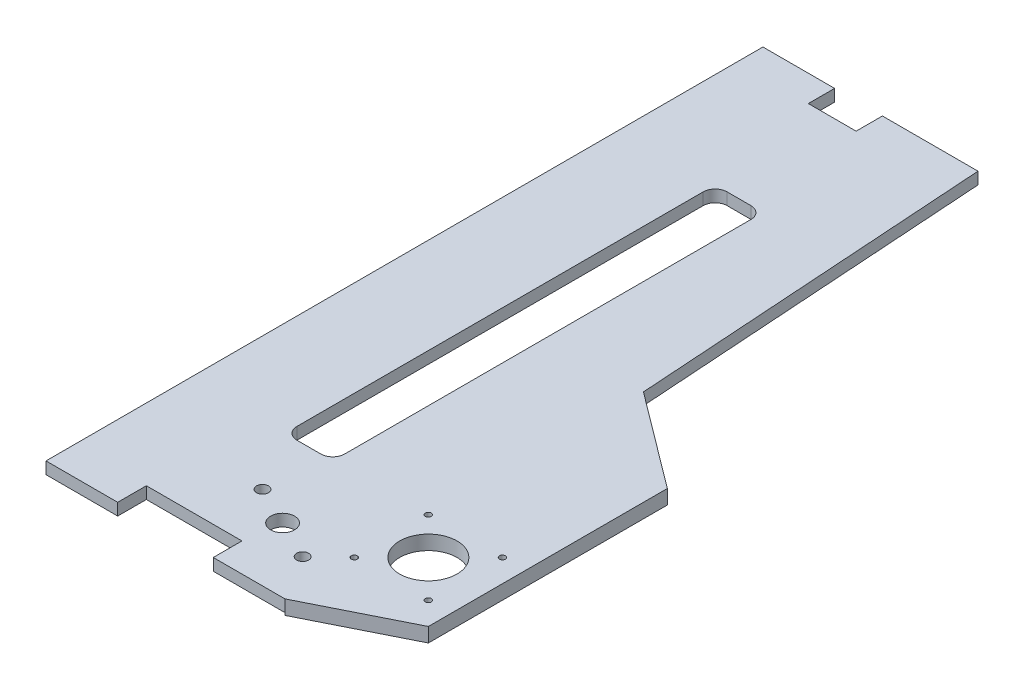
ISO-10303-21;
HEADER;
FILE_DESCRIPTION(('STEP AP214'),'2;1');
FILE_NAME('part.step','',(''),(''),'','','');
FILE_SCHEMA(('AUTOMOTIVE_DESIGN { 1 0 10303 214 1 1 1 1 }'));
ENDSEC;
DATA;
#1=APPLICATION_CONTEXT('core data for automotive mechanical design processes');
#2=APPLICATION_PROTOCOL_DEFINITION('international standard','automotive_design',2000,#1);
#3=PRODUCT_CONTEXT('',#1,'mechanical');
#4=PRODUCT('Part','Part','',(#3));
#5=PRODUCT_RELATED_PRODUCT_CATEGORY('part','',(#4));
#6=PRODUCT_DEFINITION_FORMATION('','',#4);
#7=PRODUCT_DEFINITION_CONTEXT('part definition',#1,'design');
#8=PRODUCT_DEFINITION('design','',#6,#7);
#9=PRODUCT_DEFINITION_SHAPE('','',#8);
#10=(LENGTH_UNIT() NAMED_UNIT(*) SI_UNIT(.MILLI.,.METRE.));
#11=(NAMED_UNIT(*) PLANE_ANGLE_UNIT() SI_UNIT($,.RADIAN.));
#12=(NAMED_UNIT(*) SI_UNIT($,.STERADIAN.) SOLID_ANGLE_UNIT());
#13=UNCERTAINTY_MEASURE_WITH_UNIT(LENGTH_MEASURE(1.E-05),#10,'distance_accuracy_value','');
#14=(GEOMETRIC_REPRESENTATION_CONTEXT(3) GLOBAL_UNCERTAINTY_ASSIGNED_CONTEXT((#13)) GLOBAL_UNIT_ASSIGNED_CONTEXT((#10,
#11,#12)) REPRESENTATION_CONTEXT('',''));
#15=CARTESIAN_POINT('',(0.,0.,0.));
#16=DIRECTION('',(0.,0.,1.));
#17=DIRECTION('',(1.,0.,0.));
#18=AXIS2_PLACEMENT_3D('',#15,#16,#17);
#19=CARTESIAN_POINT('',(100.,-1.,0.));
#20=DIRECTION('',(-1.,0.,0.));
#21=DIRECTION('',(0.,0.,1.));
#22=AXIS2_PLACEMENT_3D('',#19,#20,#21);
#23=PLANE('',#22);
#24=DIRECTION('',(0.,1.,0.));
#25=VECTOR('',#24,1.);
#26=CARTESIAN_POINT('',(100.,-1.,-28.354356076261));
#27=LINE('',#26,#25);
#28=CARTESIAN_POINT('',(100.,-1.,-28.354356076261));
#29=VERTEX_POINT('',#28);
#30=CARTESIAN_POINT('',(100.,0.,-28.354356076261));
#31=VERTEX_POINT('',#30);
#32=EDGE_CURVE('E508',#29,#31,#27,.T.);
#33=ORIENTED_EDGE('',*,*,#32,.F.);
#34=DIRECTION('',(0.,0.,1.));
#35=VECTOR('',#34,1.);
#36=CARTESIAN_POINT('',(100.,-1.,0.));
#37=LINE('',#36,#35);
#38=CARTESIAN_POINT('',(100.,-1.,0.));
#39=VERTEX_POINT('',#38);
#40=EDGE_CURVE('E524',#29,#39,#37,.T.);
#41=ORIENTED_EDGE('',*,*,#40,.T.);
#42=DIRECTION('',(0.,1.,0.));
#43=VECTOR('',#42,1.);
#44=CARTESIAN_POINT('',(100.,-1.,0.));
#45=LINE('',#44,#43);
#46=CARTESIAN_POINT('',(100.,0.,0.));
#47=VERTEX_POINT('',#46);
#48=EDGE_CURVE('E539',#39,#47,#45,.T.);
#49=ORIENTED_EDGE('',*,*,#48,.T.);
#50=DIRECTION('',(0.,0.,-1.));
#51=VECTOR('',#50,1.);
#52=CARTESIAN_POINT('',(100.,0.,-300.));
#53=LINE('',#52,#51);
#54=EDGE_CURVE('E286',#47,#31,#53,.T.);
#55=ORIENTED_EDGE('',*,*,#54,.T.);
#56=EDGE_LOOP('',(#33,#41,#49,#55));
#57=FACE_BOUND('',#56,.T.);
#58=ADVANCED_FACE('F39',(#57),#23,.T.);
#59=DIRECTION('',(0.,1.,0.));
#60=VECTOR('',#59,1.);
#61=CARTESIAN_POINT('',(100.,-1.,-30.645643923739));
#62=LINE('',#61,#60);
#63=CARTESIAN_POINT('',(100.,0.,-30.645643923739));
#64=VERTEX_POINT('',#63);
#65=CARTESIAN_POINT('',(100.,-1.,-30.645643923739));
#66=VERTEX_POINT('',#65);
#67=EDGE_CURVE('E502',#64,#66,#62,.F.);
#68=ORIENTED_EDGE('',*,*,#67,.F.);
#69=CARTESIAN_POINT('',(100.,0.,-59.354356076261));
#70=VERTEX_POINT('',#69);
#71=EDGE_CURVE('E291',#64,#70,#53,.T.);
#72=ORIENTED_EDGE('',*,*,#71,.T.);
#73=DIRECTION('',(0.,1.,0.));
#74=VECTOR('',#73,1.);
#75=CARTESIAN_POINT('',(100.,-1.,-59.354356076261));
#76=LINE('',#75,#74);
#77=CARTESIAN_POINT('',(100.,-1.,-59.354356076261));
#78=VERTEX_POINT('',#77);
#79=EDGE_CURVE('E499',#78,#70,#76,.T.);
#80=ORIENTED_EDGE('',*,*,#79,.F.);
#81=EDGE_CURVE('E530',#78,#66,#37,.T.);
#82=ORIENTED_EDGE('',*,*,#81,.T.);
#83=EDGE_LOOP('',(#68,#72,#80,#82));
#84=FACE_BOUND('',#83,.T.);
#85=ADVANCED_FACE('F635',(#84),#23,.T.);
#86=CARTESIAN_POINT('',(0.,5.,-300.));
#87=DIRECTION('',(0.,0.,1.));
#88=DIRECTION('',(1.,0.,0.));
#89=AXIS2_PLACEMENT_3D('',#86,#87,#88);
#90=PLANE('',#89);
#91=DIRECTION('',(-1.,0.,0.));
#92=VECTOR('',#91,1.);
#93=CARTESIAN_POINT('',(0.,5.,-300.));
#94=LINE('',#93,#92);
#95=CARTESIAN_POINT('',(90.,5.,-300.));
#96=VERTEX_POINT('',#95);
#97=CARTESIAN_POINT('',(50.,5.,-300.));
#98=VERTEX_POINT('',#97);
#99=EDGE_CURVE('E240',#96,#98,#94,.T.);
#100=ORIENTED_EDGE('',*,*,#99,.F.);
#101=DIRECTION('',(0.,1.,0.));
#102=VECTOR('',#101,1.);
#103=CARTESIAN_POINT('',(90.,-1.,-300.));
#104=LINE('',#103,#102);
#105=CARTESIAN_POINT('',(90.,0.,-300.));
#106=VERTEX_POINT('',#105);
#107=EDGE_CURVE('E224',#106,#96,#104,.T.);
#108=ORIENTED_EDGE('',*,*,#107,.F.);
#109=DIRECTION('',(-1.,0.,0.));
#110=VECTOR('',#109,1.);
#111=CARTESIAN_POINT('',(0.,0.,-300.));
#112=LINE('',#111,#110);
#113=CARTESIAN_POINT('',(50.,0.,-300.));
#114=VERTEX_POINT('',#113);
#115=EDGE_CURVE('E292',#106,#114,#112,.T.);
#116=ORIENTED_EDGE('',*,*,#115,.T.);
#117=DIRECTION('',(0.,1.,0.));
#118=VECTOR('',#117,1.);
#119=CARTESIAN_POINT('',(50.,-5.,-300.));
#120=LINE('',#119,#118);
#121=EDGE_CURVE('E251',#114,#98,#120,.T.);
#122=ORIENTED_EDGE('',*,*,#121,.T.);
#123=EDGE_LOOP('',(#100,#108,#116,#122));
#124=FACE_BOUND('',#123,.T.);
#125=ADVANCED_FACE('F249',(#124),#90,.F.);
#126=CARTESIAN_POINT('',(0.,5.,0.));
#127=DIRECTION('',(1.,0.,0.));
#128=DIRECTION('',(0.,0.,-1.));
#129=AXIS2_PLACEMENT_3D('',#126,#127,#128);
#130=PLANE('',#129);
#131=DIRECTION('',(0.,0.,1.));
#132=VECTOR('',#131,1.);
#133=CARTESIAN_POINT('',(0.,0.,0.));
#134=LINE('',#133,#132);
#135=CARTESIAN_POINT('',(0.,0.,-300.));
#136=VERTEX_POINT('',#135);
#137=CARTESIAN_POINT('',(0.,0.,0.));
#138=VERTEX_POINT('',#137);
#139=EDGE_CURVE('E265',#136,#138,#134,.T.);
#140=ORIENTED_EDGE('',*,*,#139,.T.);
#141=DIRECTION('',(0.,-1.,0.));
#142=VECTOR('',#141,1.);
#143=CARTESIAN_POINT('',(0.,5.,0.));
#144=LINE('',#143,#142);
#145=CARTESIAN_POINT('',(0.,5.,0.));
#146=VERTEX_POINT('',#145);
#147=EDGE_CURVE('E315',#146,#138,#144,.T.);
#148=ORIENTED_EDGE('',*,*,#147,.F.);
#149=DIRECTION('',(0.,0.,1.));
#150=VECTOR('',#149,1.);
#151=CARTESIAN_POINT('',(0.,5.,0.));
#152=LINE('',#151,#150);
#153=CARTESIAN_POINT('',(0.,5.,-300.));
#154=VERTEX_POINT('',#153);
#155=EDGE_CURVE('E294',#154,#146,#152,.T.);
#156=ORIENTED_EDGE('',*,*,#155,.F.);
#157=DIRECTION('',(0.,-1.,0.));
#158=VECTOR('',#157,1.);
#159=CARTESIAN_POINT('',(0.,5.,-300.));
#160=LINE('',#159,#158);
#161=EDGE_CURVE('E253',#154,#136,#160,.T.);
#162=ORIENTED_EDGE('',*,*,#161,.T.);
#163=EDGE_LOOP('',(#140,#148,#156,#162));
#164=FACE_BOUND('',#163,.T.);
#165=ADVANCED_FACE('F839',(#164),#130,.F.);
#166=CARTESIAN_POINT('',(0.,5.,0.));
#167=DIRECTION('',(0.,0.,-1.));
#168=DIRECTION('',(-1.,0.,0.));
#169=AXIS2_PLACEMENT_3D('',#166,#167,#168);
#170=PLANE('',#169);
#171=DIRECTION('',(1.,0.,0.));
#172=VECTOR('',#171,1.);
#173=CARTESIAN_POINT('',(0.,0.,0.));
#174=LINE('',#173,#172);
#175=CARTESIAN_POINT('',(30.,0.,0.));
#176=VERTEX_POINT('',#175);
#177=EDGE_CURVE('E269',#138,#176,#174,.T.);
#178=ORIENTED_EDGE('',*,*,#177,.T.);
#179=DIRECTION('',(0.,-1.,0.));
#180=VECTOR('',#179,1.);
#181=CARTESIAN_POINT('',(30.,5.,0.));
#182=LINE('',#181,#180);
#183=CARTESIAN_POINT('',(30.,5.,0.));
#184=VERTEX_POINT('',#183);
#185=EDGE_CURVE('E311',#184,#176,#182,.T.);
#186=ORIENTED_EDGE('',*,*,#185,.F.);
#187=DIRECTION('',(1.,0.,0.));
#188=VECTOR('',#187,1.);
#189=CARTESIAN_POINT('',(0.,5.,0.));
#190=LINE('',#189,#188);
#191=EDGE_CURVE('E588',#146,#184,#190,.T.);
#192=ORIENTED_EDGE('',*,*,#191,.F.);
#193=ORIENTED_EDGE('',*,*,#147,.T.);
#194=EDGE_LOOP('',(#178,#186,#192,#193));
#195=FACE_BOUND('',#194,.T.);
#196=ADVANCED_FACE('F936',(#195),#170,.F.);
#197=CARTESIAN_POINT('',(30.,5.,0.));
#198=DIRECTION('',(-1.,0.,0.));
#199=DIRECTION('',(0.,0.,1.));
#200=AXIS2_PLACEMENT_3D('',#197,#198,#199);
#201=PLANE('',#200);
#202=DIRECTION('',(0.,0.,-1.));
#203=VECTOR('',#202,1.);
#204=CARTESIAN_POINT('',(30.,0.,0.));
#205=LINE('',#204,#203);
#206=CARTESIAN_POINT('',(30.,0.,-12.));
#207=VERTEX_POINT('',#206);
#208=EDGE_CURVE('E273',#176,#207,#205,.T.);
#209=ORIENTED_EDGE('',*,*,#208,.T.);
#210=DIRECTION('',(0.,-1.,0.));
#211=VECTOR('',#210,1.);
#212=CARTESIAN_POINT('',(30.,5.,-12.));
#213=LINE('',#212,#211);
#214=CARTESIAN_POINT('',(30.,5.,-12.));
#215=VERTEX_POINT('',#214);
#216=EDGE_CURVE('E307',#215,#207,#213,.T.);
#217=ORIENTED_EDGE('',*,*,#216,.F.);
#218=DIRECTION('',(0.,0.,-1.));
#219=VECTOR('',#218,1.);
#220=CARTESIAN_POINT('',(30.,5.,0.));
#221=LINE('',#220,#219);
#222=EDGE_CURVE('E591',#184,#215,#221,.T.);
#223=ORIENTED_EDGE('',*,*,#222,.F.);
#224=ORIENTED_EDGE('',*,*,#185,.T.);
#225=EDGE_LOOP('',(#209,#217,#223,#224));
#226=FACE_BOUND('',#225,.T.);
#227=ADVANCED_FACE('F940',(#226),#201,.F.);
#228=CARTESIAN_POINT('',(30.,5.,-12.));
#229=DIRECTION('',(0.,0.,-1.));
#230=DIRECTION('',(-1.,0.,0.));
#231=AXIS2_PLACEMENT_3D('',#228,#229,#230);
#232=PLANE('',#231);
#233=DIRECTION('',(1.,0.,0.));
#234=VECTOR('',#233,1.);
#235=CARTESIAN_POINT('',(30.,0.,-12.));
#236=LINE('',#235,#234);
#237=CARTESIAN_POINT('',(70.,0.,-12.));
#238=VERTEX_POINT('',#237);
#239=EDGE_CURVE('E276',#207,#238,#236,.T.);
#240=ORIENTED_EDGE('',*,*,#239,.T.);
#241=DIRECTION('',(0.,-1.,0.));
#242=VECTOR('',#241,1.);
#243=CARTESIAN_POINT('',(70.,5.,-12.));
#244=LINE('',#243,#242);
#245=CARTESIAN_POINT('',(70.,5.,-12.));
#246=VERTEX_POINT('',#245);
#247=EDGE_CURVE('E303',#246,#238,#244,.T.);
#248=ORIENTED_EDGE('',*,*,#247,.F.);
#249=DIRECTION('',(1.,0.,0.));
#250=VECTOR('',#249,1.);
#251=CARTESIAN_POINT('',(30.,5.,-12.));
#252=LINE('',#251,#250);
#253=EDGE_CURVE('E594',#215,#246,#252,.T.);
#254=ORIENTED_EDGE('',*,*,#253,.F.);
#255=ORIENTED_EDGE('',*,*,#216,.T.);
#256=EDGE_LOOP('',(#240,#248,#254,#255));
#257=FACE_BOUND('',#256,.T.);
#258=ADVANCED_FACE('F944',(#257),#232,.F.);
#259=CARTESIAN_POINT('',(70.,5.,-12.));
#260=DIRECTION('',(1.,0.,0.));
#261=DIRECTION('',(0.,0.,-1.));
#262=AXIS2_PLACEMENT_3D('',#259,#260,#261);
#263=PLANE('',#262);
#264=DIRECTION('',(0.,0.,1.));
#265=VECTOR('',#264,1.);
#266=CARTESIAN_POINT('',(70.,0.,-12.));
#267=LINE('',#266,#265);
#268=CARTESIAN_POINT('',(70.,0.,0.));
#269=VERTEX_POINT('',#268);
#270=EDGE_CURVE('E279',#238,#269,#267,.T.);
#271=ORIENTED_EDGE('',*,*,#270,.T.);
#272=DIRECTION('',(0.,-1.,0.));
#273=VECTOR('',#272,1.);
#274=CARTESIAN_POINT('',(70.,5.,0.));
#275=LINE('',#274,#273);
#276=CARTESIAN_POINT('',(70.,5.,0.));
#277=VERTEX_POINT('',#276);
#278=EDGE_CURVE('E299',#277,#269,#275,.T.);
#279=ORIENTED_EDGE('',*,*,#278,.F.);
#280=DIRECTION('',(0.,0.,1.));
#281=VECTOR('',#280,1.);
#282=CARTESIAN_POINT('',(70.,5.,-12.));
#283=LINE('',#282,#281);
#284=EDGE_CURVE('E596',#246,#277,#283,.T.);
#285=ORIENTED_EDGE('',*,*,#284,.F.);
#286=ORIENTED_EDGE('',*,*,#247,.T.);
#287=EDGE_LOOP('',(#271,#279,#285,#286));
#288=FACE_BOUND('',#287,.T.);
#289=ADVANCED_FACE('F750',(#288),#263,.F.);
#290=CARTESIAN_POINT('',(70.,5.,0.));
#291=DIRECTION('',(0.,0.,-1.));
#292=DIRECTION('',(-1.,0.,0.));
#293=AXIS2_PLACEMENT_3D('',#290,#291,#292);
#294=PLANE('',#293);
#295=DIRECTION('',(1.,0.,0.));
#296=VECTOR('',#295,1.);
#297=CARTESIAN_POINT('',(70.,0.,0.));
#298=LINE('',#297,#296);
#299=EDGE_CURVE('E282',#269,#47,#298,.T.);
#300=ORIENTED_EDGE('',*,*,#299,.T.);
#301=DIRECTION('',(0.,-1.,0.));
#302=VECTOR('',#301,1.);
#303=CARTESIAN_POINT('',(100.,5.,0.));
#304=LINE('',#303,#302);
#305=CARTESIAN_POINT('',(100.,5.,0.));
#306=VERTEX_POINT('',#305);
#307=EDGE_CURVE('E259',#306,#47,#304,.T.);
#308=ORIENTED_EDGE('',*,*,#307,.F.);
#309=DIRECTION('',(1.,0.,0.));
#310=VECTOR('',#309,1.);
#311=CARTESIAN_POINT('',(70.,5.,0.));
#312=LINE('',#311,#310);
#313=EDGE_CURVE('E261',#277,#306,#312,.T.);
#314=ORIENTED_EDGE('',*,*,#313,.F.);
#315=ORIENTED_EDGE('',*,*,#278,.T.);
#316=EDGE_LOOP('',(#300,#308,#314,#315));
#317=FACE_BOUND('',#316,.T.);
#318=ADVANCED_FACE('F605',(#317),#294,.F.);
#319=CARTESIAN_POINT('',(30.,5.,-300.));
#320=VERTEX_POINT('',#319);
#321=EDGE_CURVE('E254',#320,#154,#94,.T.);
#322=ORIENTED_EDGE('',*,*,#321,.F.);
#323=DIRECTION('',(0.,1.,0.));
#324=VECTOR('',#323,1.);
#325=CARTESIAN_POINT('',(30.,-5.,-300.));
#326=LINE('',#325,#324);
#327=CARTESIAN_POINT('',(30.,0.,-300.));
#328=VERTEX_POINT('',#327);
#329=EDGE_CURVE('E570',#328,#320,#326,.T.);
#330=ORIENTED_EDGE('',*,*,#329,.F.);
#331=EDGE_CURVE('E290',#328,#136,#112,.T.);
#332=ORIENTED_EDGE('',*,*,#331,.T.);
#333=ORIENTED_EDGE('',*,*,#161,.F.);
#334=EDGE_LOOP('',(#322,#330,#332,#333));
#335=FACE_BOUND('',#334,.T.);
#336=ADVANCED_FACE('F661',(#335),#90,.F.);
#337=CARTESIAN_POINT('',(0.,5.,0.));
#338=DIRECTION('',(0.,-1.,0.));
#339=DIRECTION('',(0.,0.,-1.));
#340=AXIS2_PLACEMENT_3D('',#337,#338,#339);
#341=PLANE('',#340);
#342=DIRECTION('',(-1.,0.,0.));
#343=VECTOR('',#342,1.);
#344=CARTESIAN_POINT('',(40.,5.,-240.));
#345=LINE('',#344,#343);
#346=CARTESIAN_POINT('',(55.,5.,-240.));
#347=VERTEX_POINT('',#346);
#348=CARTESIAN_POINT('',(45.,5.,-240.));
#349=VERTEX_POINT('',#348);
#350=EDGE_CURVE('E412',#347,#349,#345,.T.);
#351=ORIENTED_EDGE('',*,*,#350,.F.);
#352=CARTESIAN_POINT('',(55.,5.,-235.));
#353=DIRECTION('',(0.,-1.,0.));
#354=DIRECTION('',(0.,0.,-1.));
#355=AXIS2_PLACEMENT_3D('',#352,#353,#354);
#356=CIRCLE('',#355,5.);
#357=CARTESIAN_POINT('',(60.,5.,-235.));
#358=VERTEX_POINT('',#357);
#359=EDGE_CURVE('E391',#347,#358,#356,.T.);
#360=ORIENTED_EDGE('',*,*,#359,.T.);
#361=DIRECTION('',(0.,0.,-1.));
#362=VECTOR('',#361,1.);
#363=CARTESIAN_POINT('',(60.,5.,-240.));
#364=LINE('',#363,#362);
#365=CARTESIAN_POINT('',(60.,5.,-65.0000000000001));
#366=VERTEX_POINT('',#365);
#367=EDGE_CURVE('E432',#366,#358,#364,.T.);
#368=ORIENTED_EDGE('',*,*,#367,.F.);
#369=CARTESIAN_POINT('',(55.,5.,-65.));
#370=DIRECTION('',(0.,-1.,0.));
#371=DIRECTION('',(0.,0.,-1.));
#372=AXIS2_PLACEMENT_3D('',#369,#370,#371);
#373=CIRCLE('',#372,5.);
#374=CARTESIAN_POINT('',(55.,5.,-60.));
#375=VERTEX_POINT('',#374);
#376=EDGE_CURVE('E55',#366,#375,#373,.T.);
#377=ORIENTED_EDGE('',*,*,#376,.T.);
#378=DIRECTION('',(1.,0.,0.));
#379=VECTOR('',#378,1.);
#380=CARTESIAN_POINT('',(40.,5.,-60.));
#381=LINE('',#380,#379);
#382=CARTESIAN_POINT('',(45.,5.,-60.));
#383=VERTEX_POINT('',#382);
#384=EDGE_CURVE('E246',#383,#375,#381,.T.);
#385=ORIENTED_EDGE('',*,*,#384,.F.);
#386=CARTESIAN_POINT('',(45.,5.,-65.));
#387=DIRECTION('',(0.,-1.,0.));
#388=DIRECTION('',(0.,0.,-1.));
#389=AXIS2_PLACEMENT_3D('',#386,#387,#388);
#390=CIRCLE('',#389,5.);
#391=CARTESIAN_POINT('',(40.,5.,-65.0000000000001));
#392=VERTEX_POINT('',#391);
#393=EDGE_CURVE('E48',#383,#392,#390,.T.);
#394=ORIENTED_EDGE('',*,*,#393,.T.);
#395=DIRECTION('',(0.,0.,1.));
#396=VECTOR('',#395,1.);
#397=CARTESIAN_POINT('',(40.,5.,-240.));
#398=LINE('',#397,#396);
#399=CARTESIAN_POINT('',(40.,5.,-235.));
#400=VERTEX_POINT('',#399);
#401=EDGE_CURVE('E406',#400,#392,#398,.T.);
#402=ORIENTED_EDGE('',*,*,#401,.F.);
#403=CARTESIAN_POINT('',(45.,5.,-235.));
#404=DIRECTION('',(0.,-1.,0.));
#405=DIRECTION('',(0.,0.,-1.));
#406=AXIS2_PLACEMENT_3D('',#403,#404,#405);
#407=CIRCLE('',#406,5.);
#408=EDGE_CURVE('E385',#400,#349,#407,.T.);
#409=ORIENTED_EDGE('',*,*,#408,.T.);
#410=EDGE_LOOP('',(#351,#360,#368,#377,#385,#394,#402,#409));
#411=FACE_BOUND('',#410,.T.);
#412=CARTESIAN_POINT('',(115.,5.,-45.));
#413=DIRECTION('',(0.,1.,0.));
#414=DIRECTION('',(0.,0.,1.));
#415=AXIS2_PLACEMENT_3D('',#412,#413,#414);
#416=CIRCLE('',#415,12.);
#417=CARTESIAN_POINT('',(115.,5.,-33.));
#418=VERTEX_POINT('',#417);
#419=EDGE_CURVE('E453',#418,#418,#416,.T.);
#420=ORIENTED_EDGE('',*,*,#419,.F.);
#421=EDGE_LOOP('',(#420));
#422=FACE_BOUND('',#421,.T.);
#423=CARTESIAN_POINT('',(130.5,5.,-29.5));
#424=DIRECTION('',(0.,1.,0.));
#425=DIRECTION('',(0.,0.,1.));
#426=AXIS2_PLACEMENT_3D('',#423,#424,#425);
#427=CIRCLE('',#426,1.25000000000001);
#428=CARTESIAN_POINT('',(130.5,5.,-28.25));
#429=VERTEX_POINT('',#428);
#430=EDGE_CURVE('E475',#429,#429,#427,.T.);
#431=ORIENTED_EDGE('',*,*,#430,.F.);
#432=EDGE_LOOP('',(#431));
#433=FACE_BOUND('',#432,.T.);
#434=CARTESIAN_POINT('',(99.5,5.,-29.5));
#435=DIRECTION('',(0.,1.,0.));
#436=DIRECTION('',(0.,0.,1.));
#437=AXIS2_PLACEMENT_3D('',#434,#435,#436);
#438=CIRCLE('',#437,1.25000000000001);
#439=CARTESIAN_POINT('',(99.5,5.,-28.25));
#440=VERTEX_POINT('',#439);
#441=EDGE_CURVE('E467',#440,#440,#438,.T.);
#442=ORIENTED_EDGE('',*,*,#441,.F.);
#443=EDGE_LOOP('',(#442));
#444=FACE_BOUND('',#443,.T.);
#445=CARTESIAN_POINT('',(99.5,5.,-60.5));
#446=DIRECTION('',(0.,1.,0.));
#447=DIRECTION('',(0.,0.,1.));
#448=AXIS2_PLACEMENT_3D('',#445,#446,#447);
#449=CIRCLE('',#448,1.25);
#450=CARTESIAN_POINT('',(99.5,5.,-59.25));
#451=VERTEX_POINT('',#450);
#452=EDGE_CURVE('E459',#451,#451,#449,.T.);
#453=ORIENTED_EDGE('',*,*,#452,.F.);
#454=EDGE_LOOP('',(#453));
#455=FACE_BOUND('',#454,.T.);
#456=CARTESIAN_POINT('',(130.5,5.,-60.5));
#457=DIRECTION('',(0.,1.,0.));
#458=DIRECTION('',(0.,0.,1.));
#459=AXIS2_PLACEMENT_3D('',#456,#457,#458);
#460=CIRCLE('',#459,1.25000000000001);
#461=CARTESIAN_POINT('',(130.5,5.,-59.25));
#462=VERTEX_POINT('',#461);
#463=EDGE_CURVE('E458',#462,#462,#460,.T.);
#464=ORIENTED_EDGE('',*,*,#463,.F.);
#465=EDGE_LOOP('',(#464));
#466=FACE_BOUND('',#465,.T.);
#467=CARTESIAN_POINT('',(55.5968752976758,5.,-35.));
#468=DIRECTION('',(0.,1.,0.));
#469=DIRECTION('',(0.,0.,1.));
#470=AXIS2_PLACEMENT_3D('',#467,#468,#469);
#471=CIRCLE('',#470,2.49999999999999);
#472=CARTESIAN_POINT('',(55.5968752976758,5.,-32.5));
#473=VERTEX_POINT('',#472);
#474=EDGE_CURVE('E566',#473,#473,#471,.T.);
#475=ORIENTED_EDGE('',*,*,#474,.F.);
#476=EDGE_LOOP('',(#475));
#477=FACE_BOUND('',#476,.T.);
#478=CARTESIAN_POINT('',(88.4031247023242,5.,-19.));
#479=DIRECTION('',(0.,1.,0.));
#480=DIRECTION('',(0.,0.,1.));
#481=AXIS2_PLACEMENT_3D('',#478,#479,#480);
#482=CIRCLE('',#481,2.50000000000001);
#483=CARTESIAN_POINT('',(88.4031247023242,5.,-16.5));
#484=VERTEX_POINT('',#483);
#485=EDGE_CURVE('E575',#484,#484,#482,.T.);
#486=ORIENTED_EDGE('',*,*,#485,.F.);
#487=EDGE_LOOP('',(#486));
#488=FACE_BOUND('',#487,.T.);
#489=CARTESIAN_POINT('',(72.,5.,-27.));
#490=DIRECTION('',(0.,1.,0.));
#491=DIRECTION('',(0.,0.,1.));
#492=AXIS2_PLACEMENT_3D('',#489,#490,#491);
#493=CIRCLE('',#492,4.99999999999998);
#494=CARTESIAN_POINT('',(72.,5.,-22.));
#495=VERTEX_POINT('',#494);
#496=EDGE_CURVE('E325',#495,#495,#493,.T.);
#497=ORIENTED_EDGE('',*,*,#496,.F.);
#498=EDGE_LOOP('',(#497));
#499=FACE_BOUND('',#498,.T.);
#500=DIRECTION('',(-0.8,0.,-0.6));
#501=VECTOR('',#500,1.);
#502=CARTESIAN_POINT('',(100.,5.,-150.));
#503=LINE('',#502,#501);
#504=CARTESIAN_POINT('',(140.,5.,-120.));
#505=VERTEX_POINT('',#504);
#506=CARTESIAN_POINT('',(100.,5.,-150.));
#507=VERTEX_POINT('',#506);
#508=EDGE_CURVE('E244',#505,#507,#503,.T.);
#509=ORIENTED_EDGE('',*,*,#508,.T.);
#510=DIRECTION('',(0.0665190105237741,0.,0.997785157856609));
#511=VECTOR('',#510,1.);
#512=CARTESIAN_POINT('',(90.,5.,-300.));
#513=LINE('',#512,#511);
#514=EDGE_CURVE('E227',#96,#507,#513,.T.);
#515=ORIENTED_EDGE('',*,*,#514,.F.);
#516=ORIENTED_EDGE('',*,*,#99,.T.);
#517=DIRECTION('',(0.,0.,-1.));
#518=VECTOR('',#517,1.);
#519=CARTESIAN_POINT('',(50.,5.,-300.));
#520=LINE('',#519,#518);
#521=CARTESIAN_POINT('',(50.,5.,-289.));
#522=VERTEX_POINT('',#521);
#523=EDGE_CURVE('E543',#522,#98,#520,.T.);
#524=ORIENTED_EDGE('',*,*,#523,.F.);
#525=DIRECTION('',(1.,0.,0.));
#526=VECTOR('',#525,1.);
#527=CARTESIAN_POINT('',(50.,5.,-289.));
#528=LINE('',#527,#526);
#529=CARTESIAN_POINT('',(30.,5.,-289.));
#530=VERTEX_POINT('',#529);
#531=EDGE_CURVE('E559',#530,#522,#528,.T.);
#532=ORIENTED_EDGE('',*,*,#531,.F.);
#533=DIRECTION('',(0.,0.,1.));
#534=VECTOR('',#533,1.);
#535=CARTESIAN_POINT('',(30.,5.,-300.));
#536=LINE('',#535,#534);
#537=EDGE_CURVE('E555',#320,#530,#536,.T.);
#538=ORIENTED_EDGE('',*,*,#537,.F.);
#539=ORIENTED_EDGE('',*,*,#321,.T.);
#540=ORIENTED_EDGE('',*,*,#155,.T.);
#541=ORIENTED_EDGE('',*,*,#191,.T.);
#542=ORIENTED_EDGE('',*,*,#222,.T.);
#543=ORIENTED_EDGE('',*,*,#253,.T.);
#544=ORIENTED_EDGE('',*,*,#284,.T.);
#545=ORIENTED_EDGE('',*,*,#313,.T.);
#546=DIRECTION('',(0.894427190999916,0.,-0.447213595499958));
#547=VECTOR('',#546,1.);
#548=CARTESIAN_POINT('',(140.,5.,-20.));
#549=LINE('',#548,#547);
#550=CARTESIAN_POINT('',(140.,5.,-20.));
#551=VERTEX_POINT('',#550);
#552=EDGE_CURVE('E511',#306,#551,#549,.T.);
#553=ORIENTED_EDGE('',*,*,#552,.T.);
#554=DIRECTION('',(0.,0.,-1.));
#555=VECTOR('',#554,1.);
#556=CARTESIAN_POINT('',(140.,5.,-120.));
#557=LINE('',#556,#555);
#558=EDGE_CURVE('E534',#551,#505,#557,.T.);
#559=ORIENTED_EDGE('',*,*,#558,.T.);
#560=EDGE_LOOP('',(#509,#515,#516,#524,#532,#538,#539,#540,#541,#542,#543,#544,#545,#553,#559));
#561=FACE_BOUND('',#560,.T.);
#562=ADVANCED_FACE('F238',(#411,#422,#433,#444,#455,#466,#477,#488,#499,#561),#341,.F.);
#563=CARTESIAN_POINT('',(0.,0.,0.));
#564=DIRECTION('',(0.,-1.,0.));
#565=DIRECTION('',(0.,0.,-1.));
#566=AXIS2_PLACEMENT_3D('',#563,#564,#565);
#567=PLANE('',#566);
#568=DIRECTION('',(-0.0665190105237741,0.,-0.997785157856609));
#569=VECTOR('',#568,1.);
#570=CARTESIAN_POINT('',(109.513274336283,0.,-7.30088495575223));
#571=LINE('',#570,#569);
#572=CARTESIAN_POINT('',(100.,0.,-150.));
#573=VERTEX_POINT('',#572);
#574=EDGE_CURVE('E230',#573,#106,#571,.T.);
#575=ORIENTED_EDGE('',*,*,#574,.F.);
#576=CARTESIAN_POINT('',(100.,0.,-61.645643923739));
#577=VERTEX_POINT('',#576);
#578=EDGE_CURVE('E285',#577,#573,#53,.T.);
#579=ORIENTED_EDGE('',*,*,#578,.F.);
#580=CARTESIAN_POINT('',(99.5,0.,-60.5));
#581=DIRECTION('',(0.,-1.,0.));
#582=DIRECTION('',(0.,0.,-1.));
#583=AXIS2_PLACEMENT_3D('',#580,#581,#582);
#584=CIRCLE('',#583,1.25);
#585=EDGE_CURVE('E496',#70,#577,#584,.T.);
#586=ORIENTED_EDGE('',*,*,#585,.F.);
#587=ORIENTED_EDGE('',*,*,#71,.F.);
#588=CARTESIAN_POINT('',(99.5,0.,-29.5));
#589=DIRECTION('',(0.,-1.,0.));
#590=DIRECTION('',(0.,0.,-1.));
#591=AXIS2_PLACEMENT_3D('',#588,#589,#590);
#592=CIRCLE('',#591,1.25000000000001);
#593=EDGE_CURVE('E505',#31,#64,#592,.T.);
#594=ORIENTED_EDGE('',*,*,#593,.F.);
#595=ORIENTED_EDGE('',*,*,#54,.F.);
#596=ORIENTED_EDGE('',*,*,#299,.F.);
#597=ORIENTED_EDGE('',*,*,#270,.F.);
#598=ORIENTED_EDGE('',*,*,#239,.F.);
#599=ORIENTED_EDGE('',*,*,#208,.F.);
#600=ORIENTED_EDGE('',*,*,#177,.F.);
#601=ORIENTED_EDGE('',*,*,#139,.F.);
#602=ORIENTED_EDGE('',*,*,#331,.F.);
#603=DIRECTION('',(0.,0.,-1.));
#604=VECTOR('',#603,1.);
#605=CARTESIAN_POINT('',(30.,0.,0.));
#606=LINE('',#605,#604);
#607=CARTESIAN_POINT('',(30.,0.,-289.));
#608=VERTEX_POINT('',#607);
#609=EDGE_CURVE('E319',#608,#328,#606,.T.);
#610=ORIENTED_EDGE('',*,*,#609,.F.);
#611=DIRECTION('',(-1.,0.,0.));
#612=VECTOR('',#611,1.);
#613=CARTESIAN_POINT('',(0.,0.,-289.));
#614=LINE('',#613,#612);
#615=CARTESIAN_POINT('',(50.,0.,-289.));
#616=VERTEX_POINT('',#615);
#617=EDGE_CURVE('E334',#616,#608,#614,.T.);
#618=ORIENTED_EDGE('',*,*,#617,.F.);
#619=DIRECTION('',(0.,0.,1.));
#620=VECTOR('',#619,1.);
#621=CARTESIAN_POINT('',(50.,0.,0.));
#622=LINE('',#621,#620);
#623=EDGE_CURVE('E338',#114,#616,#622,.T.);
#624=ORIENTED_EDGE('',*,*,#623,.F.);
#625=ORIENTED_EDGE('',*,*,#115,.F.);
#626=EDGE_LOOP('',(#575,#579,#586,#587,#594,#595,#596,#597,#598,#599,#600,#601,#602,#610,#618,
#624,#625));
#627=FACE_BOUND('',#626,.T.);
#628=DIRECTION('',(0.,0.,1.));
#629=VECTOR('',#628,1.);
#630=CARTESIAN_POINT('',(60.,0.,0.));
#631=LINE('',#630,#629);
#632=CARTESIAN_POINT('',(60.,0.,-235.));
#633=VERTEX_POINT('',#632);
#634=CARTESIAN_POINT('',(60.,0.,-65.));
#635=VERTEX_POINT('',#634);
#636=EDGE_CURVE('E354',#633,#635,#631,.T.);
#637=ORIENTED_EDGE('',*,*,#636,.F.);
#638=CARTESIAN_POINT('',(55.,0.,-235.));
#639=DIRECTION('',(0.,-1.,0.));
#640=DIRECTION('',(0.,0.,-1.));
#641=AXIS2_PLACEMENT_3D('',#638,#639,#640);
#642=CIRCLE('',#641,5.);
#643=CARTESIAN_POINT('',(55.,0.,-240.));
#644=VERTEX_POINT('',#643);
#645=EDGE_CURVE('E394',#633,#644,#642,.F.);
#646=ORIENTED_EDGE('',*,*,#645,.T.);
#647=DIRECTION('',(1.,0.,0.));
#648=VECTOR('',#647,1.);
#649=CARTESIAN_POINT('',(0.,0.,-240.));
#650=LINE('',#649,#648);
#651=CARTESIAN_POINT('',(45.,0.,-240.));
#652=VERTEX_POINT('',#651);
#653=EDGE_CURVE('E342',#652,#644,#650,.T.);
#654=ORIENTED_EDGE('',*,*,#653,.F.);
#655=CARTESIAN_POINT('',(45.,0.,-235.));
#656=DIRECTION('',(0.,-1.,0.));
#657=DIRECTION('',(0.,0.,-1.));
#658=AXIS2_PLACEMENT_3D('',#655,#656,#657);
#659=CIRCLE('',#658,5.);
#660=CARTESIAN_POINT('',(40.,0.,-235.));
#661=VERTEX_POINT('',#660);
#662=EDGE_CURVE('E388',#652,#661,#659,.F.);
#663=ORIENTED_EDGE('',*,*,#662,.T.);
#664=DIRECTION('',(0.,0.,-1.));
#665=VECTOR('',#664,1.);
#666=CARTESIAN_POINT('',(40.,0.,0.));
#667=LINE('',#666,#665);
#668=CARTESIAN_POINT('',(40.,0.,-65.));
#669=VERTEX_POINT('',#668);
#670=EDGE_CURVE('E346',#669,#661,#667,.T.);
#671=ORIENTED_EDGE('',*,*,#670,.F.);
#672=CARTESIAN_POINT('',(45.,0.,-65.));
#673=DIRECTION('',(0.,-1.,0.));
#674=DIRECTION('',(0.,0.,-1.));
#675=AXIS2_PLACEMENT_3D('',#672,#673,#674);
#676=CIRCLE('',#675,5.);
#677=CARTESIAN_POINT('',(45.,0.,-60.));
#678=VERTEX_POINT('',#677);
#679=EDGE_CURVE('E11',#669,#678,#676,.F.);
#680=ORIENTED_EDGE('',*,*,#679,.T.);
#681=DIRECTION('',(-1.,0.,0.));
#682=VECTOR('',#681,1.);
#683=CARTESIAN_POINT('',(0.,0.,-60.));
#684=LINE('',#683,#682);
#685=CARTESIAN_POINT('',(55.,0.,-60.));
#686=VERTEX_POINT('',#685);
#687=EDGE_CURVE('E350',#686,#678,#684,.T.);
#688=ORIENTED_EDGE('',*,*,#687,.F.);
#689=CARTESIAN_POINT('',(55.,0.,-65.));
#690=DIRECTION('',(0.,-1.,0.));
#691=DIRECTION('',(0.,0.,-1.));
#692=AXIS2_PLACEMENT_3D('',#689,#690,#691);
#693=CIRCLE('',#692,5.);
#694=EDGE_CURVE('E399',#686,#635,#693,.F.);
#695=ORIENTED_EDGE('',*,*,#694,.T.);
#696=EDGE_LOOP('',(#637,#646,#654,#663,#671,#680,#688,#695));
#697=FACE_BOUND('',#696,.T.);
#698=CARTESIAN_POINT('',(55.5968752976758,0.,-35.));
#699=DIRECTION('',(0.,-1.,0.));
#700=DIRECTION('',(0.,0.,-1.));
#701=AXIS2_PLACEMENT_3D('',#698,#699,#700);
#702=CIRCLE('',#701,2.49999999999999);
#703=CARTESIAN_POINT('',(55.5968752976758,0.,-37.5));
#704=VERTEX_POINT('',#703);
#705=EDGE_CURVE('E270',#704,#704,#702,.T.);
#706=ORIENTED_EDGE('',*,*,#705,.F.);
#707=EDGE_LOOP('',(#706));
#708=FACE_BOUND('',#707,.T.);
#709=CARTESIAN_POINT('',(88.4031247023242,0.,-19.));
#710=DIRECTION('',(0.,-1.,0.));
#711=DIRECTION('',(0.,0.,-1.));
#712=AXIS2_PLACEMENT_3D('',#709,#710,#711);
#713=CIRCLE('',#712,2.50000000000001);
#714=CARTESIAN_POINT('',(88.4031247023242,0.,-21.5));
#715=VERTEX_POINT('',#714);
#716=EDGE_CURVE('E324',#715,#715,#713,.T.);
#717=ORIENTED_EDGE('',*,*,#716,.F.);
#718=EDGE_LOOP('',(#717));
#719=FACE_BOUND('',#718,.T.);
#720=CARTESIAN_POINT('',(72.,0.,-27.));
#721=DIRECTION('',(0.,-1.,0.));
#722=DIRECTION('',(0.,0.,-1.));
#723=AXIS2_PLACEMENT_3D('',#720,#721,#722);
#724=CIRCLE('',#723,4.99999999999998);
#725=CARTESIAN_POINT('',(72.,0.,-32.));
#726=VERTEX_POINT('',#725);
#727=EDGE_CURVE('E320',#726,#726,#724,.T.);
#728=ORIENTED_EDGE('',*,*,#727,.F.);
#729=EDGE_LOOP('',(#728));
#730=FACE_BOUND('',#729,.T.);
#731=ADVANCED_FACE('F418',(#627,#697,#708,#719,#730),#567,.T.);
#732=CARTESIAN_POINT('',(72.,-1.,-27.));
#733=DIRECTION('',(0.,1.,0.));
#734=DIRECTION('',(0.,0.,1.));
#735=AXIS2_PLACEMENT_3D('',#732,#733,#734);
#736=CYLINDRICAL_SURFACE('',#735,4.99999999999998);
#737=ORIENTED_EDGE('',*,*,#727,.T.);
#738=EDGE_LOOP('',(#737));
#739=FACE_BOUND('',#738,.T.);
#740=ORIENTED_EDGE('',*,*,#496,.T.);
#741=EDGE_LOOP('',(#740));
#742=FACE_BOUND('',#741,.T.);
#743=ADVANCED_FACE('F673',(#739,#742),#736,.F.);
#744=CARTESIAN_POINT('',(88.4031247023242,-1.,-19.));
#745=DIRECTION('',(0.,1.,0.));
#746=DIRECTION('',(0.,0.,1.));
#747=AXIS2_PLACEMENT_3D('',#744,#745,#746);
#748=CYLINDRICAL_SURFACE('',#747,2.50000000000001);
#749=ORIENTED_EDGE('',*,*,#716,.T.);
#750=EDGE_LOOP('',(#749));
#751=FACE_BOUND('',#750,.T.);
#752=ORIENTED_EDGE('',*,*,#485,.T.);
#753=EDGE_LOOP('',(#752));
#754=FACE_BOUND('',#753,.T.);
#755=ADVANCED_FACE('F675',(#751,#754),#748,.F.);
#756=CARTESIAN_POINT('',(55.5968752976758,-1.,-35.));
#757=DIRECTION('',(0.,1.,0.));
#758=DIRECTION('',(0.,0.,1.));
#759=AXIS2_PLACEMENT_3D('',#756,#757,#758);
#760=CYLINDRICAL_SURFACE('',#759,2.49999999999999);
#761=ORIENTED_EDGE('',*,*,#705,.T.);
#762=EDGE_LOOP('',(#761));
#763=FACE_BOUND('',#762,.T.);
#764=ORIENTED_EDGE('',*,*,#474,.T.);
#765=EDGE_LOOP('',(#764));
#766=FACE_BOUND('',#765,.T.);
#767=ADVANCED_FACE('F682',(#763,#766),#760,.F.);
#768=CARTESIAN_POINT('',(50.,-5.,-300.));
#769=DIRECTION('',(1.,0.,0.));
#770=DIRECTION('',(0.,0.,-1.));
#771=AXIS2_PLACEMENT_3D('',#768,#769,#770);
#772=PLANE('',#771);
#773=ORIENTED_EDGE('',*,*,#623,.T.);
#774=DIRECTION('',(0.,1.,0.));
#775=VECTOR('',#774,1.);
#776=CARTESIAN_POINT('',(50.,-5.,-289.));
#777=LINE('',#776,#775);
#778=EDGE_CURVE('E563',#616,#522,#777,.T.);
#779=ORIENTED_EDGE('',*,*,#778,.T.);
#780=ORIENTED_EDGE('',*,*,#523,.T.);
#781=ORIENTED_EDGE('',*,*,#121,.F.);
#782=EDGE_LOOP('',(#773,#779,#780,#781));
#783=FACE_BOUND('',#782,.T.);
#784=ADVANCED_FACE('F710',(#783),#772,.F.);
#785=CARTESIAN_POINT('',(50.,-5.,-289.));
#786=DIRECTION('',(0.,0.,1.));
#787=DIRECTION('',(1.,0.,0.));
#788=AXIS2_PLACEMENT_3D('',#785,#786,#787);
#789=PLANE('',#788);
#790=ORIENTED_EDGE('',*,*,#617,.T.);
#791=DIRECTION('',(0.,1.,0.));
#792=VECTOR('',#791,1.);
#793=CARTESIAN_POINT('',(30.,-5.,-289.));
#794=LINE('',#793,#792);
#795=EDGE_CURVE('E567',#608,#530,#794,.T.);
#796=ORIENTED_EDGE('',*,*,#795,.T.);
#797=ORIENTED_EDGE('',*,*,#531,.T.);
#798=ORIENTED_EDGE('',*,*,#778,.F.);
#799=EDGE_LOOP('',(#790,#796,#797,#798));
#800=FACE_BOUND('',#799,.T.);
#801=ADVANCED_FACE('F704',(#800),#789,.F.);
#802=CARTESIAN_POINT('',(30.,-5.,-300.));
#803=DIRECTION('',(-1.,0.,0.));
#804=DIRECTION('',(0.,0.,1.));
#805=AXIS2_PLACEMENT_3D('',#802,#803,#804);
#806=PLANE('',#805);
#807=ORIENTED_EDGE('',*,*,#609,.T.);
#808=ORIENTED_EDGE('',*,*,#329,.T.);
#809=ORIENTED_EDGE('',*,*,#537,.T.);
#810=ORIENTED_EDGE('',*,*,#795,.F.);
#811=EDGE_LOOP('',(#807,#808,#809,#810));
#812=FACE_BOUND('',#811,.T.);
#813=ADVANCED_FACE('F699',(#812),#806,.F.);
#814=CARTESIAN_POINT('',(140.,-1.,-20.));
#815=DIRECTION('',(0.447213595499958,0.,0.894427190999916));
#816=DIRECTION('',(0.894427190999916,0.,-0.447213595499958));
#817=AXIS2_PLACEMENT_3D('',#814,#815,#816);
#818=PLANE('',#817);
#819=ORIENTED_EDGE('',*,*,#552,.F.);
#820=ORIENTED_EDGE('',*,*,#307,.T.);
#821=ORIENTED_EDGE('',*,*,#48,.F.);
#822=DIRECTION('',(0.894427190999916,0.,-0.447213595499958));
#823=VECTOR('',#822,1.);
#824=CARTESIAN_POINT('',(140.,-1.,-20.));
#825=LINE('',#824,#823);
#826=CARTESIAN_POINT('',(140.,-1.,-20.));
#827=VERTEX_POINT('',#826);
#828=EDGE_CURVE('E512',#39,#827,#825,.T.);
#829=ORIENTED_EDGE('',*,*,#828,.T.);
#830=DIRECTION('',(0.,1.,0.));
#831=VECTOR('',#830,1.);
#832=CARTESIAN_POINT('',(140.,-1.,-20.));
#833=LINE('',#832,#831);
#834=EDGE_CURVE('E529',#827,#551,#833,.T.);
#835=ORIENTED_EDGE('',*,*,#834,.T.);
#836=EDGE_LOOP('',(#819,#820,#821,#829,#835));
#837=FACE_BOUND('',#836,.T.);
#838=ADVANCED_FACE('F610',(#837),#818,.T.);
#839=DIRECTION('',(0.,1.,0.));
#840=VECTOR('',#839,1.);
#841=CARTESIAN_POINT('',(100.,-1.,-61.645643923739));
#842=LINE('',#841,#840);
#843=CARTESIAN_POINT('',(100.,-1.,-61.645643923739));
#844=VERTEX_POINT('',#843);
#845=EDGE_CURVE('E490',#577,#844,#842,.F.);
#846=ORIENTED_EDGE('',*,*,#845,.F.);
#847=ORIENTED_EDGE('',*,*,#578,.T.);
#848=DIRECTION('',(0.,1.,0.));
#849=VECTOR('',#848,1.);
#850=CARTESIAN_POINT('',(100.,-1.,-150.));
#851=LINE('',#850,#849);
#852=CARTESIAN_POINT('',(100.,-1.,-150.));
#853=VERTEX_POINT('',#852);
#854=EDGE_CURVE('E544',#853,#573,#851,.T.);
#855=ORIENTED_EDGE('',*,*,#854,.F.);
#856=EDGE_CURVE('E525',#853,#844,#37,.T.);
#857=ORIENTED_EDGE('',*,*,#856,.T.);
#858=EDGE_LOOP('',(#846,#847,#855,#857));
#859=FACE_BOUND('',#858,.T.);
#860=ADVANCED_FACE('F627',(#859),#23,.T.);
#861=CARTESIAN_POINT('',(100.,-1.,-150.));
#862=DIRECTION('',(0.6,0.,-0.8));
#863=DIRECTION('',(-0.8,0.,-0.6));
#864=AXIS2_PLACEMENT_3D('',#861,#862,#863);
#865=PLANE('',#864);
#866=ORIENTED_EDGE('',*,*,#508,.F.);
#867=DIRECTION('',(0.,1.,0.));
#868=VECTOR('',#867,1.);
#869=CARTESIAN_POINT('',(140.,-1.,-120.));
#870=LINE('',#869,#868);
#871=CARTESIAN_POINT('',(140.,-1.,-120.));
#872=VERTEX_POINT('',#871);
#873=EDGE_CURVE('E548',#872,#505,#870,.T.);
#874=ORIENTED_EDGE('',*,*,#873,.F.);
#875=DIRECTION('',(-0.8,0.,-0.6));
#876=VECTOR('',#875,1.);
#877=CARTESIAN_POINT('',(100.,-1.,-150.));
#878=LINE('',#877,#876);
#879=EDGE_CURVE('E520',#872,#853,#878,.T.);
#880=ORIENTED_EDGE('',*,*,#879,.T.);
#881=ORIENTED_EDGE('',*,*,#854,.T.);
#882=EDGE_CURVE('E341',#573,#507,#851,.T.);
#883=ORIENTED_EDGE('',*,*,#882,.T.);
#884=EDGE_LOOP('',(#866,#874,#880,#881,#883));
#885=FACE_BOUND('',#884,.T.);
#886=ADVANCED_FACE('F618',(#885),#865,.T.);
#887=CARTESIAN_POINT('',(140.,-1.,-120.));
#888=DIRECTION('',(1.,0.,0.));
#889=DIRECTION('',(0.,0.,-1.));
#890=AXIS2_PLACEMENT_3D('',#887,#888,#889);
#891=PLANE('',#890);
#892=ORIENTED_EDGE('',*,*,#558,.F.);
#893=ORIENTED_EDGE('',*,*,#834,.F.);
#894=DIRECTION('',(0.,0.,-1.));
#895=VECTOR('',#894,1.);
#896=CARTESIAN_POINT('',(140.,-1.,-120.));
#897=LINE('',#896,#895);
#898=EDGE_CURVE('E516',#827,#872,#897,.T.);
#899=ORIENTED_EDGE('',*,*,#898,.T.);
#900=ORIENTED_EDGE('',*,*,#873,.T.);
#901=EDGE_LOOP('',(#892,#893,#899,#900));
#902=FACE_BOUND('',#901,.T.);
#903=ADVANCED_FACE('F615',(#902),#891,.T.);
#904=CARTESIAN_POINT('',(0.,-1.,0.));
#905=DIRECTION('',(0.,-1.,0.));
#906=DIRECTION('',(0.,0.,-1.));
#907=AXIS2_PLACEMENT_3D('',#904,#905,#906);
#908=PLANE('',#907);
#909=CARTESIAN_POINT('',(115.,-1.,-45.));
#910=DIRECTION('',(0.,1.,0.));
#911=DIRECTION('',(0.,0.,1.));
#912=AXIS2_PLACEMENT_3D('',#909,#910,#911);
#913=CIRCLE('',#912,12.);
#914=CARTESIAN_POINT('',(115.,-1.,-33.));
#915=VERTEX_POINT('',#914);
#916=EDGE_CURVE('E479',#915,#915,#913,.T.);
#917=ORIENTED_EDGE('',*,*,#916,.T.);
#918=EDGE_LOOP('',(#917));
#919=FACE_BOUND('',#918,.T.);
#920=CARTESIAN_POINT('',(130.5,-1.,-29.5));
#921=DIRECTION('',(0.,1.,0.));
#922=DIRECTION('',(0.,0.,1.));
#923=AXIS2_PLACEMENT_3D('',#920,#921,#922);
#924=CIRCLE('',#923,1.25000000000001);
#925=CARTESIAN_POINT('',(130.5,-1.,-28.25));
#926=VERTEX_POINT('',#925);
#927=EDGE_CURVE('E471',#926,#926,#924,.T.);
#928=ORIENTED_EDGE('',*,*,#927,.T.);
#929=EDGE_LOOP('',(#928));
#930=FACE_BOUND('',#929,.T.);
#931=CARTESIAN_POINT('',(99.5,-1.,-29.5));
#932=DIRECTION('',(0.,1.,0.));
#933=DIRECTION('',(0.,0.,1.));
#934=AXIS2_PLACEMENT_3D('',#931,#932,#933);
#935=CIRCLE('',#934,1.25000000000001);
#936=EDGE_CURVE('E463',#29,#66,#935,.T.);
#937=ORIENTED_EDGE('',*,*,#936,.T.);
#938=ORIENTED_EDGE('',*,*,#81,.F.);
#939=CARTESIAN_POINT('',(99.5,-1.,-60.5));
#940=DIRECTION('',(0.,1.,0.));
#941=DIRECTION('',(0.,0.,1.));
#942=AXIS2_PLACEMENT_3D('',#939,#940,#941);
#943=CIRCLE('',#942,1.25);
#944=EDGE_CURVE('E454',#78,#844,#943,.T.);
#945=ORIENTED_EDGE('',*,*,#944,.T.);
#946=ORIENTED_EDGE('',*,*,#856,.F.);
#947=ORIENTED_EDGE('',*,*,#879,.F.);
#948=ORIENTED_EDGE('',*,*,#898,.F.);
#949=ORIENTED_EDGE('',*,*,#828,.F.);
#950=ORIENTED_EDGE('',*,*,#40,.F.);
#951=EDGE_LOOP('',(#937,#938,#945,#946,#947,#948,#949,#950));
#952=FACE_BOUND('',#951,.T.);
#953=CARTESIAN_POINT('',(130.5,-1.,-60.5));
#954=DIRECTION('',(0.,1.,0.));
#955=DIRECTION('',(0.,0.,1.));
#956=AXIS2_PLACEMENT_3D('',#953,#954,#955);
#957=CIRCLE('',#956,1.25000000000001);
#958=CARTESIAN_POINT('',(130.5,-1.,-59.25));
#959=VERTEX_POINT('',#958);
#960=EDGE_CURVE('E486',#959,#959,#957,.T.);
#961=ORIENTED_EDGE('',*,*,#960,.T.);
#962=EDGE_LOOP('',(#961));
#963=FACE_BOUND('',#962,.T.);
#964=ADVANCED_FACE('F644',(#919,#930,#952,#963),#908,.T.);
#965=CARTESIAN_POINT('',(130.5,-1.,-60.5));
#966=DIRECTION('',(0.,1.,0.));
#967=DIRECTION('',(0.,0.,1.));
#968=AXIS2_PLACEMENT_3D('',#965,#966,#967);
#969=CYLINDRICAL_SURFACE('',#968,1.25000000000001);
#970=ORIENTED_EDGE('',*,*,#960,.F.);
#971=EDGE_LOOP('',(#970));
#972=FACE_BOUND('',#971,.T.);
#973=ORIENTED_EDGE('',*,*,#463,.T.);
#974=EDGE_LOOP('',(#973));
#975=FACE_BOUND('',#974,.T.);
#976=ADVANCED_FACE('F789',(#972,#975),#969,.F.);
#977=CARTESIAN_POINT('',(99.5,-1.,-60.5));
#978=DIRECTION('',(0.,1.,0.));
#979=DIRECTION('',(0.,0.,1.));
#980=AXIS2_PLACEMENT_3D('',#977,#978,#979);
#981=CYLINDRICAL_SURFACE('',#980,1.25);
#982=ORIENTED_EDGE('',*,*,#79,.T.);
#983=ORIENTED_EDGE('',*,*,#585,.T.);
#984=ORIENTED_EDGE('',*,*,#845,.T.);
#985=ORIENTED_EDGE('',*,*,#944,.F.);
#986=EDGE_LOOP('',(#982,#983,#984,#985));
#987=FACE_BOUND('',#986,.T.);
#988=ORIENTED_EDGE('',*,*,#452,.T.);
#989=EDGE_LOOP('',(#988));
#990=FACE_BOUND('',#989,.T.);
#991=ADVANCED_FACE('F640',(#987,#990),#981,.F.);
#992=CARTESIAN_POINT('',(99.5,-1.,-29.5));
#993=DIRECTION('',(0.,1.,0.));
#994=DIRECTION('',(0.,0.,1.));
#995=AXIS2_PLACEMENT_3D('',#992,#993,#994);
#996=CYLINDRICAL_SURFACE('',#995,1.25000000000001);
#997=ORIENTED_EDGE('',*,*,#32,.T.);
#998=ORIENTED_EDGE('',*,*,#593,.T.);
#999=ORIENTED_EDGE('',*,*,#67,.T.);
#1000=ORIENTED_EDGE('',*,*,#936,.F.);
#1001=EDGE_LOOP('',(#997,#998,#999,#1000));
#1002=FACE_BOUND('',#1001,.T.);
#1003=ORIENTED_EDGE('',*,*,#441,.T.);
#1004=EDGE_LOOP('',(#1003));
#1005=FACE_BOUND('',#1004,.T.);
#1006=ADVANCED_FACE('F652',(#1002,#1005),#996,.F.);
#1007=CARTESIAN_POINT('',(130.5,-1.,-29.5));
#1008=DIRECTION('',(0.,1.,0.));
#1009=DIRECTION('',(0.,0.,1.));
#1010=AXIS2_PLACEMENT_3D('',#1007,#1008,#1009);
#1011=CYLINDRICAL_SURFACE('',#1010,1.25000000000001);
#1012=ORIENTED_EDGE('',*,*,#927,.F.);
#1013=EDGE_LOOP('',(#1012));
#1014=FACE_BOUND('',#1013,.T.);
#1015=ORIENTED_EDGE('',*,*,#430,.T.);
#1016=EDGE_LOOP('',(#1015));
#1017=FACE_BOUND('',#1016,.T.);
#1018=ADVANCED_FACE('F655',(#1014,#1017),#1011,.F.);
#1019=CARTESIAN_POINT('',(115.,-1.,-45.));
#1020=DIRECTION('',(0.,1.,0.));
#1021=DIRECTION('',(0.,0.,1.));
#1022=AXIS2_PLACEMENT_3D('',#1019,#1020,#1021);
#1023=CYLINDRICAL_SURFACE('',#1022,12.);
#1024=ORIENTED_EDGE('',*,*,#916,.F.);
#1025=EDGE_LOOP('',(#1024));
#1026=FACE_BOUND('',#1025,.T.);
#1027=ORIENTED_EDGE('',*,*,#419,.T.);
#1028=EDGE_LOOP('',(#1027));
#1029=FACE_BOUND('',#1028,.T.);
#1030=ADVANCED_FACE('F820',(#1026,#1029),#1023,.F.);
#1031=CARTESIAN_POINT('',(90.,-1.,-300.));
#1032=DIRECTION('',(-0.997785157856609,0.,0.0665190105237741));
#1033=DIRECTION('',(0.0665190105237741,0.,0.997785157856609));
#1034=AXIS2_PLACEMENT_3D('',#1031,#1032,#1033);
#1035=PLANE('',#1034);
#1036=ORIENTED_EDGE('',*,*,#574,.T.);
#1037=ORIENTED_EDGE('',*,*,#107,.T.);
#1038=ORIENTED_EDGE('',*,*,#514,.T.);
#1039=ORIENTED_EDGE('',*,*,#882,.F.);
#1040=EDGE_LOOP('',(#1036,#1037,#1038,#1039));
#1041=FACE_BOUND('',#1040,.T.);
#1042=ADVANCED_FACE('F226',(#1041),#1035,.F.);
#1043=CARTESIAN_POINT('',(60.,-1.,-240.));
#1044=DIRECTION('',(1.,0.,0.));
#1045=DIRECTION('',(0.,0.,-1.));
#1046=AXIS2_PLACEMENT_3D('',#1043,#1044,#1045);
#1047=PLANE('',#1046);
#1048=ORIENTED_EDGE('',*,*,#367,.T.);
#1049=DIRECTION('',(0.,1.,0.));
#1050=VECTOR('',#1049,1.);
#1051=CARTESIAN_POINT('',(60.,0.,-235.));
#1052=LINE('',#1051,#1050);
#1053=EDGE_CURVE('E376',#358,#633,#1052,.F.);
#1054=ORIENTED_EDGE('',*,*,#1053,.T.);
#1055=ORIENTED_EDGE('',*,*,#636,.T.);
#1056=DIRECTION('',(0.,1.,0.));
#1057=VECTOR('',#1056,1.);
#1058=CARTESIAN_POINT('',(60.,5.,-65.));
#1059=LINE('',#1058,#1057);
#1060=EDGE_CURVE('E372',#635,#366,#1059,.T.);
#1061=ORIENTED_EDGE('',*,*,#1060,.T.);
#1062=EDGE_LOOP('',(#1048,#1054,#1055,#1061));
#1063=FACE_BOUND('',#1062,.T.);
#1064=ADVANCED_FACE('F430',(#1063),#1047,.F.);
#1065=CARTESIAN_POINT('',(40.,-1.,-60.));
#1066=DIRECTION('',(0.,0.,1.));
#1067=DIRECTION('',(1.,0.,0.));
#1068=AXIS2_PLACEMENT_3D('',#1065,#1066,#1067);
#1069=PLANE('',#1068);
#1070=ORIENTED_EDGE('',*,*,#384,.T.);
#1071=DIRECTION('',(0.,1.,0.));
#1072=VECTOR('',#1071,1.);
#1073=CARTESIAN_POINT('',(55.,0.,-60.));
#1074=LINE('',#1073,#1072);
#1075=EDGE_CURVE('E382',#375,#686,#1074,.F.);
#1076=ORIENTED_EDGE('',*,*,#1075,.T.);
#1077=ORIENTED_EDGE('',*,*,#687,.T.);
#1078=DIRECTION('',(0.,1.,0.));
#1079=VECTOR('',#1078,1.);
#1080=CARTESIAN_POINT('',(45.,5.,-60.));
#1081=LINE('',#1080,#1079);
#1082=EDGE_CURVE('E379',#678,#383,#1081,.T.);
#1083=ORIENTED_EDGE('',*,*,#1082,.T.);
#1084=EDGE_LOOP('',(#1070,#1076,#1077,#1083));
#1085=FACE_BOUND('',#1084,.T.);
#1086=ADVANCED_FACE('F422',(#1085),#1069,.F.);
#1087=CARTESIAN_POINT('',(40.,-1.,-240.));
#1088=DIRECTION('',(-1.,0.,0.));
#1089=DIRECTION('',(0.,0.,1.));
#1090=AXIS2_PLACEMENT_3D('',#1087,#1088,#1089);
#1091=PLANE('',#1090);
#1092=ORIENTED_EDGE('',*,*,#670,.T.);
#1093=DIRECTION('',(0.,1.,0.));
#1094=VECTOR('',#1093,1.);
#1095=CARTESIAN_POINT('',(40.,5.,-235.));
#1096=LINE('',#1095,#1094);
#1097=EDGE_CURVE('E361',#661,#400,#1096,.T.);
#1098=ORIENTED_EDGE('',*,*,#1097,.T.);
#1099=ORIENTED_EDGE('',*,*,#401,.T.);
#1100=DIRECTION('',(0.,1.,0.));
#1101=VECTOR('',#1100,1.);
#1102=CARTESIAN_POINT('',(40.,0.,-65.));
#1103=LINE('',#1102,#1101);
#1104=EDGE_CURVE('E358',#392,#669,#1103,.F.);
#1105=ORIENTED_EDGE('',*,*,#1104,.T.);
#1106=EDGE_LOOP('',(#1092,#1098,#1099,#1105));
#1107=FACE_BOUND('',#1106,.T.);
#1108=ADVANCED_FACE('F408',(#1107),#1091,.F.);
#1109=CARTESIAN_POINT('',(40.,-1.,-240.));
#1110=DIRECTION('',(0.,0.,-1.));
#1111=DIRECTION('',(-1.,0.,0.));
#1112=AXIS2_PLACEMENT_3D('',#1109,#1110,#1111);
#1113=PLANE('',#1112);
#1114=ORIENTED_EDGE('',*,*,#350,.T.);
#1115=DIRECTION('',(0.,1.,0.));
#1116=VECTOR('',#1115,1.);
#1117=CARTESIAN_POINT('',(45.,0.,-240.));
#1118=LINE('',#1117,#1116);
#1119=EDGE_CURVE('E369',#349,#652,#1118,.F.);
#1120=ORIENTED_EDGE('',*,*,#1119,.T.);
#1121=ORIENTED_EDGE('',*,*,#653,.T.);
#1122=DIRECTION('',(0.,1.,0.));
#1123=VECTOR('',#1122,1.);
#1124=CARTESIAN_POINT('',(55.,5.,-240.));
#1125=LINE('',#1124,#1123);
#1126=EDGE_CURVE('E365',#644,#347,#1125,.T.);
#1127=ORIENTED_EDGE('',*,*,#1126,.T.);
#1128=EDGE_LOOP('',(#1114,#1120,#1121,#1127));
#1129=FACE_BOUND('',#1128,.T.);
#1130=ADVANCED_FACE('F440',(#1129),#1113,.F.);
#1131=CARTESIAN_POINT('',(45.,-1.,-235.));
#1132=DIRECTION('',(0.,-1.,0.));
#1133=DIRECTION('',(0.,0.,-1.));
#1134=AXIS2_PLACEMENT_3D('',#1131,#1132,#1133);
#1135=CYLINDRICAL_SURFACE('',#1134,5.);
#1136=ORIENTED_EDGE('',*,*,#662,.F.);
#1137=ORIENTED_EDGE('',*,*,#1119,.F.);
#1138=ORIENTED_EDGE('',*,*,#408,.F.);
#1139=ORIENTED_EDGE('',*,*,#1097,.F.);
#1140=EDGE_LOOP('',(#1136,#1137,#1138,#1139));
#1141=FACE_BOUND('',#1140,.T.);
#1142=ADVANCED_FACE('F443',(#1141),#1135,.F.);
#1143=CARTESIAN_POINT('',(55.,-1.,-235.));
#1144=DIRECTION('',(0.,-1.,0.));
#1145=DIRECTION('',(0.,0.,-1.));
#1146=AXIS2_PLACEMENT_3D('',#1143,#1144,#1145);
#1147=CYLINDRICAL_SURFACE('',#1146,5.);
#1148=ORIENTED_EDGE('',*,*,#645,.F.);
#1149=ORIENTED_EDGE('',*,*,#1053,.F.);
#1150=ORIENTED_EDGE('',*,*,#359,.F.);
#1151=ORIENTED_EDGE('',*,*,#1126,.F.);
#1152=EDGE_LOOP('',(#1148,#1149,#1150,#1151));
#1153=FACE_BOUND('',#1152,.T.);
#1154=ADVANCED_FACE('F434',(#1153),#1147,.F.);
#1155=CARTESIAN_POINT('',(55.,-1.,-65.));
#1156=DIRECTION('',(0.,-1.,0.));
#1157=DIRECTION('',(0.,0.,-1.));
#1158=AXIS2_PLACEMENT_3D('',#1155,#1156,#1157);
#1159=CYLINDRICAL_SURFACE('',#1158,5.);
#1160=ORIENTED_EDGE('',*,*,#694,.F.);
#1161=ORIENTED_EDGE('',*,*,#1075,.F.);
#1162=ORIENTED_EDGE('',*,*,#376,.F.);
#1163=ORIENTED_EDGE('',*,*,#1060,.F.);
#1164=EDGE_LOOP('',(#1160,#1161,#1162,#1163));
#1165=FACE_BOUND('',#1164,.T.);
#1166=ADVANCED_FACE('F425',(#1165),#1159,.F.);
#1167=CARTESIAN_POINT('',(45.,-1.,-65.));
#1168=DIRECTION('',(0.,-1.,0.));
#1169=DIRECTION('',(0.,0.,-1.));
#1170=AXIS2_PLACEMENT_3D('',#1167,#1168,#1169);
#1171=CYLINDRICAL_SURFACE('',#1170,5.);
#1172=ORIENTED_EDGE('',*,*,#679,.F.);
#1173=ORIENTED_EDGE('',*,*,#1104,.F.);
#1174=ORIENTED_EDGE('',*,*,#393,.F.);
#1175=ORIENTED_EDGE('',*,*,#1082,.F.);
#1176=EDGE_LOOP('',(#1172,#1173,#1174,#1175));
#1177=FACE_BOUND('',#1176,.T.);
#1178=ADVANCED_FACE('F41',(#1177),#1171,.F.);
#1179=CLOSED_SHELL('',(#58,#85,#125,#165,#196,#227,#258,#289,#318,#336,#562,#731,#743,#755,#767,
#784,#801,#813,#838,#860,#886,#903,#964,#976,#991,#1006,#1018,#1030,#1042,#1064,#1086,#1108,
#1130,#1142,#1154,#1166,#1178));
#1180=MANIFOLD_SOLID_BREP('B2',#1179);
#1181=ADVANCED_BREP_SHAPE_REPRESENTATION('',(#18,#1180),#14);
#1182=SHAPE_DEFINITION_REPRESENTATION(#9,#1181);
ENDSEC;
END-ISO-10303-21;
